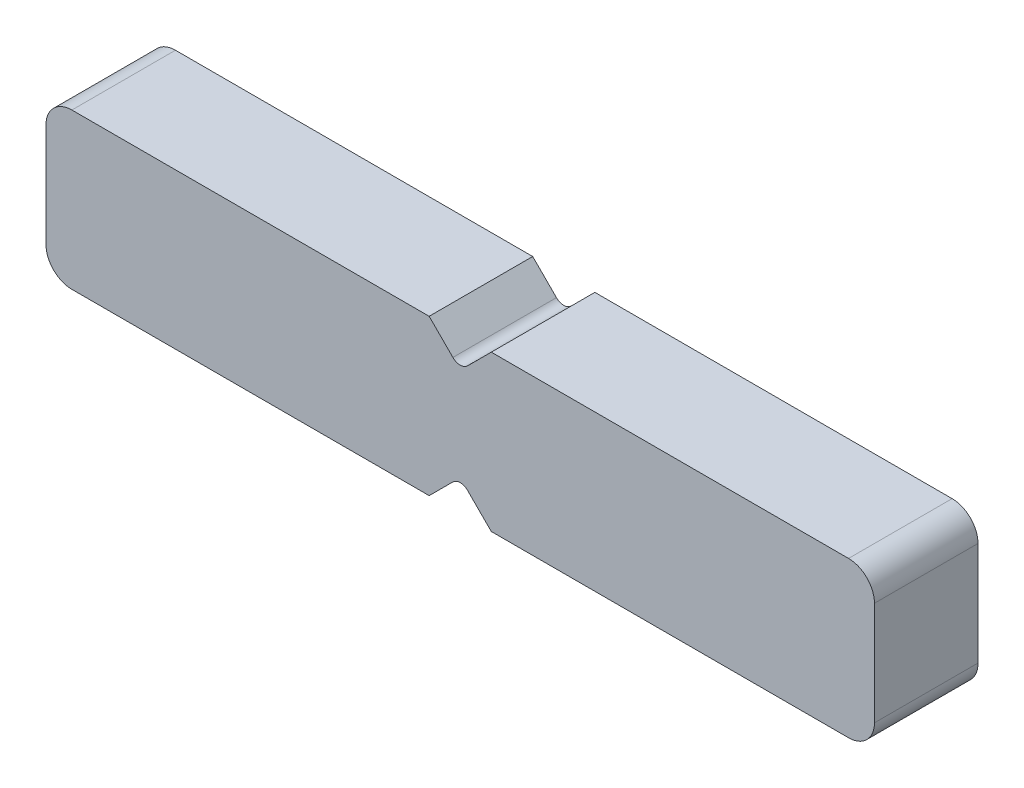
ISO-10303-21;
HEADER;
FILE_DESCRIPTION(('STEP AP214'),'2;1');
FILE_NAME('part.step','',(''),(''),'','','');
FILE_SCHEMA(('AUTOMOTIVE_DESIGN { 1 0 10303 214 1 1 1 1 }'));
ENDSEC;
DATA;
#1=APPLICATION_CONTEXT('core data for automotive mechanical design processes');
#2=APPLICATION_PROTOCOL_DEFINITION('international standard','automotive_design',2000,#1);
#3=PRODUCT_CONTEXT('',#1,'mechanical');
#4=PRODUCT('Part','Part','',(#3));
#5=PRODUCT_RELATED_PRODUCT_CATEGORY('part','',(#4));
#6=PRODUCT_DEFINITION_FORMATION('','',#4);
#7=PRODUCT_DEFINITION_CONTEXT('part definition',#1,'design');
#8=PRODUCT_DEFINITION('design','',#6,#7);
#9=PRODUCT_DEFINITION_SHAPE('','',#8);
#10=(LENGTH_UNIT() NAMED_UNIT(*) SI_UNIT(.MILLI.,.METRE.));
#11=(NAMED_UNIT(*) PLANE_ANGLE_UNIT() SI_UNIT($,.RADIAN.));
#12=(NAMED_UNIT(*) SI_UNIT($,.STERADIAN.) SOLID_ANGLE_UNIT());
#13=UNCERTAINTY_MEASURE_WITH_UNIT(LENGTH_MEASURE(1.E-05),#10,'distance_accuracy_value','');
#14=(GEOMETRIC_REPRESENTATION_CONTEXT(3) GLOBAL_UNCERTAINTY_ASSIGNED_CONTEXT((#13)) GLOBAL_UNIT_ASSIGNED_CONTEXT((#10,
#11,#12)) REPRESENTATION_CONTEXT('',''));
#15=CARTESIAN_POINT('',(0.,0.,0.));
#16=DIRECTION('',(0.,0.,1.));
#17=DIRECTION('',(1.,0.,0.));
#18=AXIS2_PLACEMENT_3D('',#15,#16,#17);
#19=CARTESIAN_POINT('',(50.8,9.525,6.35));
#20=DIRECTION('',(-1.,0.,0.));
#21=DIRECTION('',(0.,0.,1.));
#22=AXIS2_PLACEMENT_3D('',#19,#20,#21);
#23=PLANE('',#22);
#24=DIRECTION('',(0.,1.,0.));
#25=VECTOR('',#24,1.);
#26=CARTESIAN_POINT('',(50.8,9.525,6.35));
#27=LINE('',#26,#25);
#28=CARTESIAN_POINT('',(50.8,-6.34999999999999,6.35));
#29=VERTEX_POINT('',#28);
#30=CARTESIAN_POINT('',(50.8,6.35,6.35));
#31=VERTEX_POINT('',#30);
#32=EDGE_CURVE('E211',#29,#31,#27,.T.);
#33=ORIENTED_EDGE('',*,*,#32,.F.);
#34=DIRECTION('',(0.,0.,-1.));
#35=VECTOR('',#34,1.);
#36=CARTESIAN_POINT('',(50.8,-6.35,-6.35));
#37=LINE('',#36,#35);
#38=CARTESIAN_POINT('',(50.8,-6.34999999999999,-6.35));
#39=VERTEX_POINT('',#38);
#40=EDGE_CURVE('E248',#29,#39,#37,.T.);
#41=ORIENTED_EDGE('',*,*,#40,.T.);
#42=DIRECTION('',(0.,1.,0.));
#43=VECTOR('',#42,1.);
#44=CARTESIAN_POINT('',(50.8,9.525,-6.35));
#45=LINE('',#44,#43);
#46=CARTESIAN_POINT('',(50.8,6.35,-6.35));
#47=VERTEX_POINT('',#46);
#48=EDGE_CURVE('E210',#39,#47,#45,.T.);
#49=ORIENTED_EDGE('',*,*,#48,.T.);
#50=DIRECTION('',(0.,0.,-1.));
#51=VECTOR('',#50,1.);
#52=CARTESIAN_POINT('',(50.8,6.35,6.35));
#53=LINE('',#52,#51);
#54=EDGE_CURVE('E246',#47,#31,#53,.F.);
#55=ORIENTED_EDGE('',*,*,#54,.T.);
#56=EDGE_LOOP('',(#33,#41,#49,#55));
#57=FACE_BOUND('',#56,.T.);
#58=ADVANCED_FACE('F39',(#57),#23,.F.);
#59=CARTESIAN_POINT('',(3.81000000000001,9.525,6.35));
#60=DIRECTION('',(0.,-1.,0.));
#61=DIRECTION('',(0.,0.,-1.));
#62=AXIS2_PLACEMENT_3D('',#59,#60,#61);
#63=PLANE('',#62);
#64=DIRECTION('',(-1.,0.,0.));
#65=VECTOR('',#64,1.);
#66=CARTESIAN_POINT('',(3.81000000000001,9.525,6.35));
#67=LINE('',#66,#65);
#68=CARTESIAN_POINT('',(47.625,9.525,6.35));
#69=VERTEX_POINT('',#68);
#70=CARTESIAN_POINT('',(3.81000000000001,9.525,6.35));
#71=VERTEX_POINT('',#70);
#72=EDGE_CURVE('E214',#69,#71,#67,.T.);
#73=ORIENTED_EDGE('',*,*,#72,.F.);
#74=DIRECTION('',(0.,0.,-1.));
#75=VECTOR('',#74,1.);
#76=CARTESIAN_POINT('',(47.625,9.525,6.35));
#77=LINE('',#76,#75);
#78=CARTESIAN_POINT('',(47.625,9.525,-6.35));
#79=VERTEX_POINT('',#78);
#80=EDGE_CURVE('E11',#69,#79,#77,.T.);
#81=ORIENTED_EDGE('',*,*,#80,.T.);
#82=DIRECTION('',(-1.,0.,0.));
#83=VECTOR('',#82,1.);
#84=CARTESIAN_POINT('',(3.81000000000001,9.525,-6.35));
#85=LINE('',#84,#83);
#86=CARTESIAN_POINT('',(3.81000000000001,9.525,-6.35));
#87=VERTEX_POINT('',#86);
#88=EDGE_CURVE('E223',#79,#87,#85,.T.);
#89=ORIENTED_EDGE('',*,*,#88,.T.);
#90=DIRECTION('',(0.,0.,-1.));
#91=VECTOR('',#90,1.);
#92=CARTESIAN_POINT('',(3.81000000000001,9.525,6.35));
#93=LINE('',#92,#91);
#94=EDGE_CURVE('E220',#71,#87,#93,.T.);
#95=ORIENTED_EDGE('',*,*,#94,.F.);
#96=EDGE_LOOP('',(#73,#81,#89,#95));
#97=FACE_BOUND('',#96,.T.);
#98=ADVANCED_FACE('F303',(#97),#63,.F.);
#99=CARTESIAN_POINT('',(0.,5.715,6.35));
#100=DIRECTION('',(0.707106781186546,-0.707106781186548,0.));
#101=DIRECTION('',(0.707106781186549,0.707106781186547,0.));
#102=AXIS2_PLACEMENT_3D('',#99,#100,#101);
#103=PLANE('',#102);
#104=DIRECTION('',(-0.707106781186549,-0.707106781186546,0.));
#105=VECTOR('',#104,1.);
#106=CARTESIAN_POINT('',(0.,5.715,-6.35));
#107=LINE('',#106,#105);
#108=CARTESIAN_POINT('',(0.898025612106914,6.61302561210691,-6.35));
#109=VERTEX_POINT('',#108);
#110=EDGE_CURVE('E215',#87,#109,#107,.T.);
#111=ORIENTED_EDGE('',*,*,#110,.T.);
#112=DIRECTION('',(0.,0.,-1.));
#113=VECTOR('',#112,1.);
#114=CARTESIAN_POINT('',(0.898025612106914,6.61302561210691,6.35));
#115=LINE('',#114,#113);
#116=CARTESIAN_POINT('',(0.898025612106914,6.61302561210691,6.35));
#117=VERTEX_POINT('',#116);
#118=EDGE_CURVE('E236',#109,#117,#115,.F.);
#119=ORIENTED_EDGE('',*,*,#118,.T.);
#120=DIRECTION('',(-0.707106781186549,-0.707106781186546,0.));
#121=VECTOR('',#120,1.);
#122=CARTESIAN_POINT('',(0.,5.715,6.35));
#123=LINE('',#122,#121);
#124=EDGE_CURVE('E217',#71,#117,#123,.T.);
#125=ORIENTED_EDGE('',*,*,#124,.F.);
#126=ORIENTED_EDGE('',*,*,#94,.T.);
#127=EDGE_LOOP('',(#111,#119,#125,#126));
#128=FACE_BOUND('',#127,.T.);
#129=ADVANCED_FACE('F310',(#128),#103,.F.);
#130=CARTESIAN_POINT('',(0.,0.,6.35));
#131=DIRECTION('',(0.,0.,-1.));
#132=DIRECTION('',(-1.,0.,0.));
#133=AXIS2_PLACEMENT_3D('',#130,#131,#132);
#134=PLANE('',#133);
#135=DIRECTION('',(-1.,0.,0.));
#136=VECTOR('',#135,1.);
#137=CARTESIAN_POINT('',(3.81000000000001,-9.525,6.35));
#138=LINE('',#137,#136);
#139=CARTESIAN_POINT('',(47.625,-9.525,6.35));
#140=VERTEX_POINT('',#139);
#141=CARTESIAN_POINT('',(3.81000000000001,-9.525,6.35));
#142=VERTEX_POINT('',#141);
#143=EDGE_CURVE('E201',#140,#142,#138,.T.);
#144=ORIENTED_EDGE('',*,*,#143,.F.);
#145=CARTESIAN_POINT('',(47.625,-6.35,6.35));
#146=DIRECTION('',(0.,0.,-1.));
#147=DIRECTION('',(-1.,0.,0.));
#148=AXIS2_PLACEMENT_3D('',#145,#146,#147);
#149=CIRCLE('',#148,3.175);
#150=EDGE_CURVE('E265',#140,#29,#149,.F.);
#151=ORIENTED_EDGE('',*,*,#150,.T.);
#152=ORIENTED_EDGE('',*,*,#32,.T.);
#153=CARTESIAN_POINT('',(47.625,6.35,6.35));
#154=DIRECTION('',(0.,0.,-1.));
#155=DIRECTION('',(-1.,0.,0.));
#156=AXIS2_PLACEMENT_3D('',#153,#154,#155);
#157=CIRCLE('',#156,3.175);
#158=EDGE_CURVE('E261',#31,#69,#157,.F.);
#159=ORIENTED_EDGE('',*,*,#158,.T.);
#160=ORIENTED_EDGE('',*,*,#72,.T.);
#161=ORIENTED_EDGE('',*,*,#124,.T.);
#162=CARTESIAN_POINT('',(0.,7.51105122421383,6.35));
#163=DIRECTION('',(0.,0.,-1.));
#164=DIRECTION('',(-1.,0.,0.));
#165=AXIS2_PLACEMENT_3D('',#162,#163,#164);
#166=CIRCLE('',#165,1.27);
#167=CARTESIAN_POINT('',(-0.898025612106914,6.61302561210691,6.35));
#168=VERTEX_POINT('',#167);
#169=EDGE_CURVE('E244',#117,#168,#166,.T.);
#170=ORIENTED_EDGE('',*,*,#169,.T.);
#171=DIRECTION('',(0.707106781186549,-0.707106781186546,0.));
#172=VECTOR('',#171,1.);
#173=CARTESIAN_POINT('',(0.,5.715,6.35));
#174=LINE('',#173,#172);
#175=CARTESIAN_POINT('',(-3.81000000000001,9.525,6.35));
#176=VERTEX_POINT('',#175);
#177=EDGE_CURVE('E180',#176,#168,#174,.T.);
#178=ORIENTED_EDGE('',*,*,#177,.F.);
#179=DIRECTION('',(1.,0.,0.));
#180=VECTOR('',#179,1.);
#181=CARTESIAN_POINT('',(-3.81000000000001,9.525,6.35));
#182=LINE('',#181,#180);
#183=CARTESIAN_POINT('',(-47.625,9.525,6.35));
#184=VERTEX_POINT('',#183);
#185=EDGE_CURVE('E183',#184,#176,#182,.T.);
#186=ORIENTED_EDGE('',*,*,#185,.F.);
#187=CARTESIAN_POINT('',(-47.625,6.35,6.35));
#188=DIRECTION('',(0.,0.,-1.));
#189=DIRECTION('',(-1.,0.,0.));
#190=AXIS2_PLACEMENT_3D('',#187,#188,#189);
#191=CIRCLE('',#190,3.175);
#192=CARTESIAN_POINT('',(-50.8,6.35,6.35));
#193=VERTEX_POINT('',#192);
#194=EDGE_CURVE('E60',#184,#193,#191,.F.);
#195=ORIENTED_EDGE('',*,*,#194,.T.);
#196=DIRECTION('',(0.,1.,0.));
#197=VECTOR('',#196,1.);
#198=CARTESIAN_POINT('',(-50.8,9.525,6.35));
#199=LINE('',#198,#197);
#200=CARTESIAN_POINT('',(-50.8,-6.34999999999999,6.35));
#201=VERTEX_POINT('',#200);
#202=EDGE_CURVE('E186',#201,#193,#199,.T.);
#203=ORIENTED_EDGE('',*,*,#202,.F.);
#204=CARTESIAN_POINT('',(-47.625,-6.35,6.35));
#205=DIRECTION('',(0.,0.,-1.));
#206=DIRECTION('',(-1.,0.,0.));
#207=AXIS2_PLACEMENT_3D('',#204,#205,#206);
#208=CIRCLE('',#207,3.175);
#209=CARTESIAN_POINT('',(-47.625,-9.525,6.35));
#210=VERTEX_POINT('',#209);
#211=EDGE_CURVE('E54',#201,#210,#208,.F.);
#212=ORIENTED_EDGE('',*,*,#211,.T.);
#213=DIRECTION('',(1.,0.,0.));
#214=VECTOR('',#213,1.);
#215=CARTESIAN_POINT('',(-3.81000000000001,-9.525,6.35));
#216=LINE('',#215,#214);
#217=CARTESIAN_POINT('',(-3.81000000000001,-9.525,6.35));
#218=VERTEX_POINT('',#217);
#219=EDGE_CURVE('E151',#210,#218,#216,.T.);
#220=ORIENTED_EDGE('',*,*,#219,.T.);
#221=DIRECTION('',(0.707106781186549,0.707106781186546,0.));
#222=VECTOR('',#221,1.);
#223=CARTESIAN_POINT('',(0.,-5.715,6.35));
#224=LINE('',#223,#222);
#225=CARTESIAN_POINT('',(-0.898025612106914,-6.61302561210691,6.35));
#226=VERTEX_POINT('',#225);
#227=EDGE_CURVE('E156',#218,#226,#224,.T.);
#228=ORIENTED_EDGE('',*,*,#227,.T.);
#229=CARTESIAN_POINT('',(0.,-7.51105122421383,6.35));
#230=DIRECTION('',(0.,0.,-1.));
#231=DIRECTION('',(-1.,0.,0.));
#232=AXIS2_PLACEMENT_3D('',#229,#230,#231);
#233=CIRCLE('',#232,1.27);
#234=CARTESIAN_POINT('',(0.898025612106914,-6.61302561210691,6.35));
#235=VERTEX_POINT('',#234);
#236=EDGE_CURVE('E240',#226,#235,#233,.T.);
#237=ORIENTED_EDGE('',*,*,#236,.T.);
#238=DIRECTION('',(-0.707106781186549,0.707106781186546,0.));
#239=VECTOR('',#238,1.);
#240=CARTESIAN_POINT('',(0.,-5.715,6.35));
#241=LINE('',#240,#239);
#242=EDGE_CURVE('E198',#142,#235,#241,.T.);
#243=ORIENTED_EDGE('',*,*,#242,.F.);
#244=EDGE_LOOP('',(#144,#151,#152,#159,#160,#161,#170,#178,#186,#195,#203,#212,#220,#228,#237,#243));
#245=FACE_BOUND('',#244,.T.);
#246=ADVANCED_FACE('F154',(#245),#134,.F.);
#247=CARTESIAN_POINT('',(0.,0.,-6.35));
#248=DIRECTION('',(0.,0.,-1.));
#249=DIRECTION('',(-1.,0.,0.));
#250=AXIS2_PLACEMENT_3D('',#247,#248,#249);
#251=PLANE('',#250);
#252=ORIENTED_EDGE('',*,*,#48,.F.);
#253=CARTESIAN_POINT('',(47.625,-6.35,-6.35));
#254=DIRECTION('',(0.,0.,-1.));
#255=DIRECTION('',(-1.,0.,0.));
#256=AXIS2_PLACEMENT_3D('',#253,#254,#255);
#257=CIRCLE('',#256,3.175);
#258=CARTESIAN_POINT('',(47.625,-9.525,-6.35));
#259=VERTEX_POINT('',#258);
#260=EDGE_CURVE('E257',#39,#259,#257,.T.);
#261=ORIENTED_EDGE('',*,*,#260,.T.);
#262=DIRECTION('',(-1.,0.,0.));
#263=VECTOR('',#262,1.);
#264=CARTESIAN_POINT('',(3.81000000000001,-9.525,-6.35));
#265=LINE('',#264,#263);
#266=CARTESIAN_POINT('',(3.81000000000001,-9.525,-6.35));
#267=VERTEX_POINT('',#266);
#268=EDGE_CURVE('E202',#259,#267,#265,.T.);
#269=ORIENTED_EDGE('',*,*,#268,.T.);
#270=DIRECTION('',(-0.707106781186549,0.707106781186546,0.));
#271=VECTOR('',#270,1.);
#272=CARTESIAN_POINT('',(0.,-5.715,-6.35));
#273=LINE('',#272,#271);
#274=CARTESIAN_POINT('',(0.898025612106914,-6.61302561210691,-6.35));
#275=VERTEX_POINT('',#274);
#276=EDGE_CURVE('E197',#267,#275,#273,.T.);
#277=ORIENTED_EDGE('',*,*,#276,.T.);
#278=CARTESIAN_POINT('',(0.,-7.51105122421383,-6.35));
#279=DIRECTION('',(0.,0.,-1.));
#280=DIRECTION('',(-1.,0.,0.));
#281=AXIS2_PLACEMENT_3D('',#278,#279,#280);
#282=CIRCLE('',#281,1.27);
#283=CARTESIAN_POINT('',(-0.898025612106914,-6.61302561210691,-6.35));
#284=VERTEX_POINT('',#283);
#285=EDGE_CURVE('E238',#275,#284,#282,.F.);
#286=ORIENTED_EDGE('',*,*,#285,.T.);
#287=DIRECTION('',(0.707106781186549,0.707106781186546,0.));
#288=VECTOR('',#287,1.);
#289=CARTESIAN_POINT('',(0.,-5.715,-6.35));
#290=LINE('',#289,#288);
#291=CARTESIAN_POINT('',(-3.81000000000001,-9.525,-6.35));
#292=VERTEX_POINT('',#291);
#293=EDGE_CURVE('E161',#292,#284,#290,.T.);
#294=ORIENTED_EDGE('',*,*,#293,.F.);
#295=DIRECTION('',(1.,0.,0.));
#296=VECTOR('',#295,1.);
#297=CARTESIAN_POINT('',(-3.81000000000001,-9.525,-6.35));
#298=LINE('',#297,#296);
#299=CARTESIAN_POINT('',(-47.625,-9.525,-6.35));
#300=VERTEX_POINT('',#299);
#301=EDGE_CURVE('E167',#300,#292,#298,.T.);
#302=ORIENTED_EDGE('',*,*,#301,.F.);
#303=CARTESIAN_POINT('',(-47.625,-6.35,-6.35));
#304=DIRECTION('',(0.,0.,-1.));
#305=DIRECTION('',(-1.,0.,0.));
#306=AXIS2_PLACEMENT_3D('',#303,#304,#305);
#307=CIRCLE('',#306,3.175);
#308=CARTESIAN_POINT('',(-50.8,-6.34999999999999,-6.35));
#309=VERTEX_POINT('',#308);
#310=EDGE_CURVE('E255',#300,#309,#307,.T.);
#311=ORIENTED_EDGE('',*,*,#310,.T.);
#312=DIRECTION('',(0.,1.,0.));
#313=VECTOR('',#312,1.);
#314=CARTESIAN_POINT('',(-50.8,9.525,-6.35));
#315=LINE('',#314,#313);
#316=CARTESIAN_POINT('',(-50.8,6.35,-6.35));
#317=VERTEX_POINT('',#316);
#318=EDGE_CURVE('E184',#309,#317,#315,.T.);
#319=ORIENTED_EDGE('',*,*,#318,.T.);
#320=CARTESIAN_POINT('',(-47.625,6.35,-6.35));
#321=DIRECTION('',(0.,0.,-1.));
#322=DIRECTION('',(-1.,0.,0.));
#323=AXIS2_PLACEMENT_3D('',#320,#321,#322);
#324=CIRCLE('',#323,3.175);
#325=CARTESIAN_POINT('',(-47.625,9.525,-6.35));
#326=VERTEX_POINT('',#325);
#327=EDGE_CURVE('E253',#317,#326,#324,.T.);
#328=ORIENTED_EDGE('',*,*,#327,.T.);
#329=DIRECTION('',(1.,0.,0.));
#330=VECTOR('',#329,1.);
#331=CARTESIAN_POINT('',(-3.81000000000001,9.525,-6.35));
#332=LINE('',#331,#330);
#333=CARTESIAN_POINT('',(-3.81000000000001,9.525,-6.35));
#334=VERTEX_POINT('',#333);
#335=EDGE_CURVE('E191',#326,#334,#332,.T.);
#336=ORIENTED_EDGE('',*,*,#335,.T.);
#337=DIRECTION('',(0.707106781186549,-0.707106781186546,0.));
#338=VECTOR('',#337,1.);
#339=CARTESIAN_POINT('',(0.,5.715,-6.35));
#340=LINE('',#339,#338);
#341=CARTESIAN_POINT('',(-0.898025612106914,6.61302561210691,-6.35));
#342=VERTEX_POINT('',#341);
#343=EDGE_CURVE('E171',#334,#342,#340,.T.);
#344=ORIENTED_EDGE('',*,*,#343,.T.);
#345=CARTESIAN_POINT('',(0.,7.51105122421383,-6.35));
#346=DIRECTION('',(0.,0.,-1.));
#347=DIRECTION('',(-1.,0.,0.));
#348=AXIS2_PLACEMENT_3D('',#345,#346,#347);
#349=CIRCLE('',#348,1.27);
#350=EDGE_CURVE('E242',#342,#109,#349,.F.);
#351=ORIENTED_EDGE('',*,*,#350,.T.);
#352=ORIENTED_EDGE('',*,*,#110,.F.);
#353=ORIENTED_EDGE('',*,*,#88,.F.);
#354=CARTESIAN_POINT('',(47.625,6.35,-6.35));
#355=DIRECTION('',(0.,0.,-1.));
#356=DIRECTION('',(-1.,0.,0.));
#357=AXIS2_PLACEMENT_3D('',#354,#355,#356);
#358=CIRCLE('',#357,3.175);
#359=EDGE_CURVE('E251',#79,#47,#358,.T.);
#360=ORIENTED_EDGE('',*,*,#359,.T.);
#361=EDGE_LOOP('',(#252,#261,#269,#277,#286,#294,#302,#311,#319,#328,#336,#344,#351,#352,#353,#360));
#362=FACE_BOUND('',#361,.T.);
#363=ADVANCED_FACE('F288',(#362),#251,.T.);
#364=CARTESIAN_POINT('',(0.,-5.715,6.35));
#365=DIRECTION('',(-0.707106781186546,-0.707106781186548,0.));
#366=DIRECTION('',(0.707106781186549,-0.707106781186547,0.));
#367=AXIS2_PLACEMENT_3D('',#364,#365,#366);
#368=PLANE('',#367);
#369=ORIENTED_EDGE('',*,*,#242,.T.);
#370=DIRECTION('',(0.,0.,-1.));
#371=VECTOR('',#370,1.);
#372=CARTESIAN_POINT('',(0.898025612106914,-6.61302561210691,6.35));
#373=LINE('',#372,#371);
#374=EDGE_CURVE('E229',#235,#275,#373,.T.);
#375=ORIENTED_EDGE('',*,*,#374,.T.);
#376=ORIENTED_EDGE('',*,*,#276,.F.);
#377=DIRECTION('',(0.,0.,-1.));
#378=VECTOR('',#377,1.);
#379=CARTESIAN_POINT('',(3.81000000000001,-9.525,6.35));
#380=LINE('',#379,#378);
#381=EDGE_CURVE('E204',#142,#267,#380,.T.);
#382=ORIENTED_EDGE('',*,*,#381,.F.);
#383=EDGE_LOOP('',(#369,#375,#376,#382));
#384=FACE_BOUND('',#383,.T.);
#385=ADVANCED_FACE('F351',(#384),#368,.T.);
#386=CARTESIAN_POINT('',(3.81000000000001,-9.525,6.35));
#387=DIRECTION('',(0.,-1.,0.));
#388=DIRECTION('',(0.,0.,-1.));
#389=AXIS2_PLACEMENT_3D('',#386,#387,#388);
#390=PLANE('',#389);
#391=ORIENTED_EDGE('',*,*,#268,.F.);
#392=DIRECTION('',(0.,0.,-1.));
#393=VECTOR('',#392,1.);
#394=CARTESIAN_POINT('',(47.625,-9.525,6.35));
#395=LINE('',#394,#393);
#396=EDGE_CURVE('E259',#259,#140,#395,.F.);
#397=ORIENTED_EDGE('',*,*,#396,.T.);
#398=ORIENTED_EDGE('',*,*,#143,.T.);
#399=ORIENTED_EDGE('',*,*,#381,.T.);
#400=EDGE_LOOP('',(#391,#397,#398,#399));
#401=FACE_BOUND('',#400,.T.);
#402=ADVANCED_FACE('F346',(#401),#390,.T.);
#403=CARTESIAN_POINT('',(0.,5.715,6.35));
#404=DIRECTION('',(0.707106781186546,0.707106781186548,0.));
#405=DIRECTION('',(-0.707106781186549,0.707106781186547,0.));
#406=AXIS2_PLACEMENT_3D('',#403,#404,#405);
#407=PLANE('',#406);
#408=ORIENTED_EDGE('',*,*,#177,.T.);
#409=DIRECTION('',(0.,0.,-1.));
#410=VECTOR('',#409,1.);
#411=CARTESIAN_POINT('',(-0.898025612106914,6.61302561210691,6.35));
#412=LINE('',#411,#410);
#413=EDGE_CURVE('E233',#168,#342,#412,.T.);
#414=ORIENTED_EDGE('',*,*,#413,.T.);
#415=ORIENTED_EDGE('',*,*,#343,.F.);
#416=DIRECTION('',(0.,0.,-1.));
#417=VECTOR('',#416,1.);
#418=CARTESIAN_POINT('',(-3.81000000000001,9.525,6.35));
#419=LINE('',#418,#417);
#420=EDGE_CURVE('E188',#176,#334,#419,.T.);
#421=ORIENTED_EDGE('',*,*,#420,.F.);
#422=EDGE_LOOP('',(#408,#414,#415,#421));
#423=FACE_BOUND('',#422,.T.);
#424=ADVANCED_FACE('F330',(#423),#407,.T.);
#425=CARTESIAN_POINT('',(-3.81000000000001,9.525,6.35));
#426=DIRECTION('',(0.,1.,0.));
#427=DIRECTION('',(0.,0.,1.));
#428=AXIS2_PLACEMENT_3D('',#425,#426,#427);
#429=PLANE('',#428);
#430=ORIENTED_EDGE('',*,*,#335,.F.);
#431=DIRECTION('',(0.,0.,-1.));
#432=VECTOR('',#431,1.);
#433=CARTESIAN_POINT('',(-47.625,9.525,6.35));
#434=LINE('',#433,#432);
#435=EDGE_CURVE('E47',#326,#184,#434,.F.);
#436=ORIENTED_EDGE('',*,*,#435,.T.);
#437=ORIENTED_EDGE('',*,*,#185,.T.);
#438=ORIENTED_EDGE('',*,*,#420,.T.);
#439=EDGE_LOOP('',(#430,#436,#437,#438));
#440=FACE_BOUND('',#439,.T.);
#441=ADVANCED_FACE('F276',(#440),#429,.T.);
#442=CARTESIAN_POINT('',(-50.8,9.525,6.35));
#443=DIRECTION('',(-1.,0.,0.));
#444=DIRECTION('',(0.,0.,1.));
#445=AXIS2_PLACEMENT_3D('',#442,#443,#444);
#446=PLANE('',#445);
#447=ORIENTED_EDGE('',*,*,#318,.F.);
#448=DIRECTION('',(0.,0.,-1.));
#449=VECTOR('',#448,1.);
#450=CARTESIAN_POINT('',(-50.8,-6.35,6.35));
#451=LINE('',#450,#449);
#452=EDGE_CURVE('E272',#309,#201,#451,.F.);
#453=ORIENTED_EDGE('',*,*,#452,.T.);
#454=ORIENTED_EDGE('',*,*,#202,.T.);
#455=DIRECTION('',(0.,0.,-1.));
#456=VECTOR('',#455,1.);
#457=CARTESIAN_POINT('',(-50.8,6.35,6.35));
#458=LINE('',#457,#456);
#459=EDGE_CURVE('E269',#193,#317,#458,.T.);
#460=ORIENTED_EDGE('',*,*,#459,.T.);
#461=EDGE_LOOP('',(#447,#453,#454,#460));
#462=FACE_BOUND('',#461,.T.);
#463=ADVANCED_FACE('F284',(#462),#446,.T.);
#464=CARTESIAN_POINT('',(-3.81000000000001,-9.525,6.35));
#465=DIRECTION('',(0.,1.,0.));
#466=DIRECTION('',(0.,0.,1.));
#467=AXIS2_PLACEMENT_3D('',#464,#465,#466);
#468=PLANE('',#467);
#469=ORIENTED_EDGE('',*,*,#219,.F.);
#470=DIRECTION('',(0.,0.,-1.));
#471=VECTOR('',#470,1.);
#472=CARTESIAN_POINT('',(-47.625,-9.525,-6.35));
#473=LINE('',#472,#471);
#474=EDGE_CURVE('E267',#210,#300,#473,.T.);
#475=ORIENTED_EDGE('',*,*,#474,.T.);
#476=ORIENTED_EDGE('',*,*,#301,.T.);
#477=DIRECTION('',(0.,0.,-1.));
#478=VECTOR('',#477,1.);
#479=CARTESIAN_POINT('',(-3.81000000000001,-9.525,6.35));
#480=LINE('',#479,#478);
#481=EDGE_CURVE('E164',#218,#292,#480,.T.);
#482=ORIENTED_EDGE('',*,*,#481,.F.);
#483=EDGE_LOOP('',(#469,#475,#476,#482));
#484=FACE_BOUND('',#483,.T.);
#485=ADVANCED_FACE('F165',(#484),#468,.F.);
#486=CARTESIAN_POINT('',(0.,-5.715,6.35));
#487=DIRECTION('',(-0.707106781186546,0.707106781186548,0.));
#488=DIRECTION('',(-0.707106781186549,-0.707106781186547,0.));
#489=AXIS2_PLACEMENT_3D('',#486,#487,#488);
#490=PLANE('',#489);
#491=ORIENTED_EDGE('',*,*,#293,.T.);
#492=DIRECTION('',(0.,0.,-1.));
#493=VECTOR('',#492,1.);
#494=CARTESIAN_POINT('',(-0.898025612106914,-6.61302561210691,6.35));
#495=LINE('',#494,#493);
#496=EDGE_CURVE('E175',#284,#226,#495,.F.);
#497=ORIENTED_EDGE('',*,*,#496,.T.);
#498=ORIENTED_EDGE('',*,*,#227,.F.);
#499=ORIENTED_EDGE('',*,*,#481,.T.);
#500=EDGE_LOOP('',(#491,#497,#498,#499));
#501=FACE_BOUND('',#500,.T.);
#502=ADVANCED_FACE('F173',(#501),#490,.F.);
#503=CARTESIAN_POINT('',(0.,-7.51105122421383,6.35));
#504=DIRECTION('',(0.,0.,-1.));
#505=DIRECTION('',(-1.,0.,0.));
#506=AXIS2_PLACEMENT_3D('',#503,#504,#505);
#507=CYLINDRICAL_SURFACE('',#506,1.27);
#508=ORIENTED_EDGE('',*,*,#236,.F.);
#509=ORIENTED_EDGE('',*,*,#496,.F.);
#510=ORIENTED_EDGE('',*,*,#285,.F.);
#511=ORIENTED_EDGE('',*,*,#374,.F.);
#512=EDGE_LOOP('',(#508,#509,#510,#511));
#513=FACE_BOUND('',#512,.T.);
#514=ADVANCED_FACE('F316',(#513),#507,.F.);
#515=CARTESIAN_POINT('',(0.,7.51105122421383,6.35));
#516=DIRECTION('',(0.,0.,-1.));
#517=DIRECTION('',(-1.,0.,0.));
#518=AXIS2_PLACEMENT_3D('',#515,#516,#517);
#519=CYLINDRICAL_SURFACE('',#518,1.27);
#520=ORIENTED_EDGE('',*,*,#169,.F.);
#521=ORIENTED_EDGE('',*,*,#118,.F.);
#522=ORIENTED_EDGE('',*,*,#350,.F.);
#523=ORIENTED_EDGE('',*,*,#413,.F.);
#524=EDGE_LOOP('',(#520,#521,#522,#523));
#525=FACE_BOUND('',#524,.T.);
#526=ADVANCED_FACE('F299',(#525),#519,.F.);
#527=CARTESIAN_POINT('',(47.625,-6.35,6.35));
#528=DIRECTION('',(0.,0.,1.));
#529=DIRECTION('',(1.,0.,0.));
#530=AXIS2_PLACEMENT_3D('',#527,#528,#529);
#531=CYLINDRICAL_SURFACE('',#530,3.175);
#532=ORIENTED_EDGE('',*,*,#150,.F.);
#533=ORIENTED_EDGE('',*,*,#396,.F.);
#534=ORIENTED_EDGE('',*,*,#260,.F.);
#535=ORIENTED_EDGE('',*,*,#40,.F.);
#536=EDGE_LOOP('',(#532,#533,#534,#535));
#537=FACE_BOUND('',#536,.T.);
#538=ADVANCED_FACE('F292',(#537),#531,.T.);
#539=CARTESIAN_POINT('',(-47.625,-6.35,6.35));
#540=DIRECTION('',(0.,0.,1.));
#541=DIRECTION('',(1.,0.,0.));
#542=AXIS2_PLACEMENT_3D('',#539,#540,#541);
#543=CYLINDRICAL_SURFACE('',#542,3.175);
#544=ORIENTED_EDGE('',*,*,#211,.F.);
#545=ORIENTED_EDGE('',*,*,#452,.F.);
#546=ORIENTED_EDGE('',*,*,#310,.F.);
#547=ORIENTED_EDGE('',*,*,#474,.F.);
#548=EDGE_LOOP('',(#544,#545,#546,#547));
#549=FACE_BOUND('',#548,.T.);
#550=ADVANCED_FACE('F290',(#549),#543,.T.);
#551=CARTESIAN_POINT('',(-47.625,6.35,6.35));
#552=DIRECTION('',(0.,0.,-1.));
#553=DIRECTION('',(-1.,0.,0.));
#554=AXIS2_PLACEMENT_3D('',#551,#552,#553);
#555=CYLINDRICAL_SURFACE('',#554,3.175);
#556=ORIENTED_EDGE('',*,*,#194,.F.);
#557=ORIENTED_EDGE('',*,*,#435,.F.);
#558=ORIENTED_EDGE('',*,*,#327,.F.);
#559=ORIENTED_EDGE('',*,*,#459,.F.);
#560=EDGE_LOOP('',(#556,#557,#558,#559));
#561=FACE_BOUND('',#560,.T.);
#562=ADVANCED_FACE('F281',(#561),#555,.T.);
#563=CARTESIAN_POINT('',(47.625,6.35,6.35));
#564=DIRECTION('',(0.,0.,-1.));
#565=DIRECTION('',(-1.,0.,0.));
#566=AXIS2_PLACEMENT_3D('',#563,#564,#565);
#567=CYLINDRICAL_SURFACE('',#566,3.175);
#568=ORIENTED_EDGE('',*,*,#158,.F.);
#569=ORIENTED_EDGE('',*,*,#54,.F.);
#570=ORIENTED_EDGE('',*,*,#359,.F.);
#571=ORIENTED_EDGE('',*,*,#80,.F.);
#572=EDGE_LOOP('',(#568,#569,#570,#571));
#573=FACE_BOUND('',#572,.T.);
#574=ADVANCED_FACE('F41',(#573),#567,.T.);
#575=CLOSED_SHELL('',(#58,#98,#129,#246,#363,#385,#402,#424,#441,#463,#485,#502,#514,#526,#538,
#550,#562,#574));
#576=MANIFOLD_SOLID_BREP('B2',#575);
#577=ADVANCED_BREP_SHAPE_REPRESENTATION('',(#18,#576),#14);
#578=SHAPE_DEFINITION_REPRESENTATION(#9,#577);
ENDSEC;
END-ISO-10303-21;
